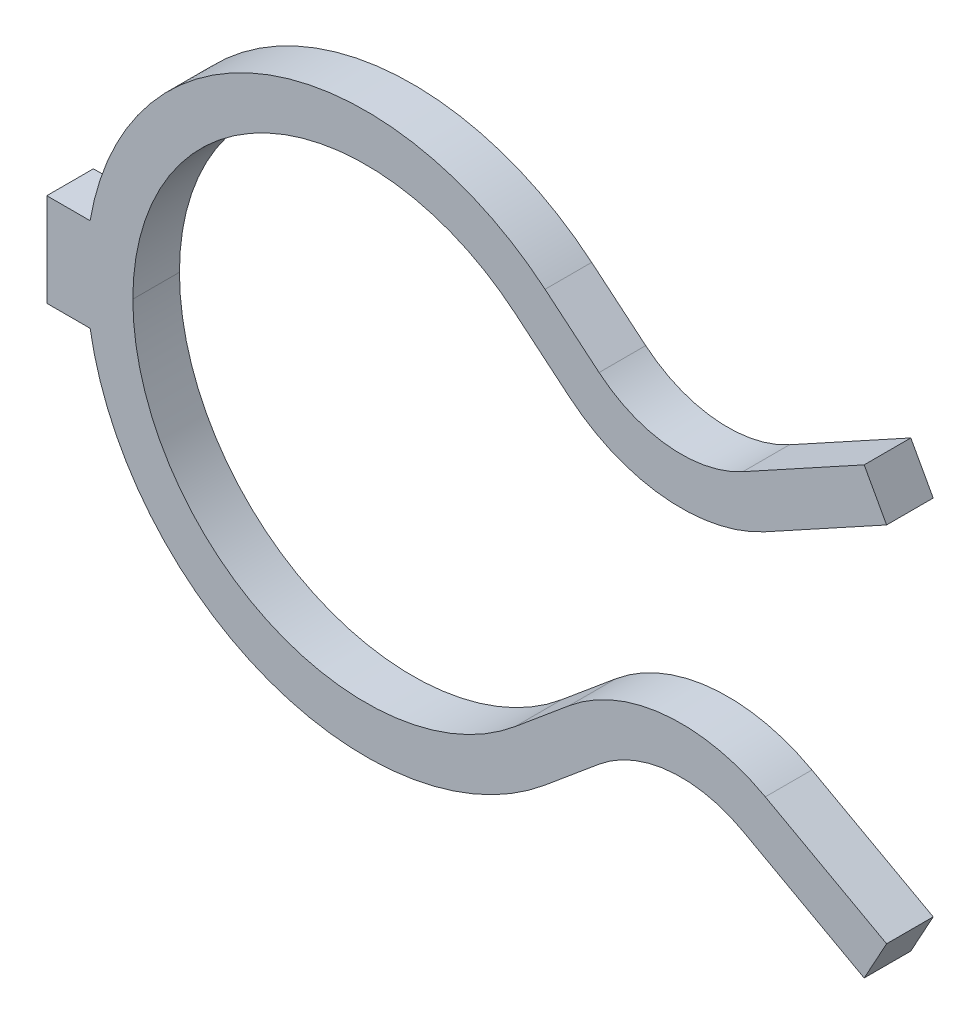
ISO-10303-21;
HEADER;
FILE_DESCRIPTION(('STEP AP214'),'2;1');
FILE_NAME('part.step','',(''),(''),'','','');
FILE_SCHEMA(('AUTOMOTIVE_DESIGN { 1 0 10303 214 1 1 1 1 }'));
ENDSEC;
DATA;
#1=APPLICATION_CONTEXT('core data for automotive mechanical design processes');
#2=APPLICATION_PROTOCOL_DEFINITION('international standard','automotive_design',2000,#1);
#3=PRODUCT_CONTEXT('',#1,'mechanical');
#4=PRODUCT('Part','Part','',(#3));
#5=PRODUCT_RELATED_PRODUCT_CATEGORY('part','',(#4));
#6=PRODUCT_DEFINITION_FORMATION('','',#4);
#7=PRODUCT_DEFINITION_CONTEXT('part definition',#1,'design');
#8=PRODUCT_DEFINITION('design','',#6,#7);
#9=PRODUCT_DEFINITION_SHAPE('','',#8);
#10=(LENGTH_UNIT() NAMED_UNIT(*) SI_UNIT(.MILLI.,.METRE.));
#11=(NAMED_UNIT(*) PLANE_ANGLE_UNIT() SI_UNIT($,.RADIAN.));
#12=(NAMED_UNIT(*) SI_UNIT($,.STERADIAN.) SOLID_ANGLE_UNIT());
#13=UNCERTAINTY_MEASURE_WITH_UNIT(LENGTH_MEASURE(1.E-05),#10,'distance_accuracy_value','');
#14=(GEOMETRIC_REPRESENTATION_CONTEXT(3) GLOBAL_UNCERTAINTY_ASSIGNED_CONTEXT((#13)) GLOBAL_UNIT_ASSIGNED_CONTEXT((#10,
#11,#12)) REPRESENTATION_CONTEXT('',''));
#15=CARTESIAN_POINT('',(0.,0.,0.));
#16=DIRECTION('',(0.,0.,1.));
#17=DIRECTION('',(1.,0.,0.));
#18=AXIS2_PLACEMENT_3D('',#15,#16,#17);
#19=CARTESIAN_POINT('',(0.,0.,5.08));
#20=DIRECTION('',(0.,0.,-1.));
#21=DIRECTION('',(-1.,0.,0.));
#22=AXIS2_PLACEMENT_3D('',#19,#20,#21);
#23=CYLINDRICAL_SURFACE('',#22,25.4);
#24=CARTESIAN_POINT('',(0.,0.,0.));
#25=DIRECTION('',(0.,0.,-1.));
#26=DIRECTION('',(1.,0.,0.));
#27=AXIS2_PLACEMENT_3D('',#24,#25,#26);
#28=CIRCLE('',#27,25.4);
#29=CARTESIAN_POINT('',(16.277171033262,-19.4990692894286,0.));
#30=VERTEX_POINT('',#29);
#31=CARTESIAN_POINT('',(-25.4,0.,0.));
#32=VERTEX_POINT('',#31);
#33=EDGE_CURVE('E296',#30,#32,#28,.T.);
#34=ORIENTED_EDGE('',*,*,#33,.T.);
#35=DIRECTION('',(0.,0.,1.));
#36=VECTOR('',#35,1.);
#37=CARTESIAN_POINT('',(-25.4,0.,5.08));
#38=LINE('',#37,#36);
#39=CARTESIAN_POINT('',(-25.4,0.,5.08));
#40=VERTEX_POINT('',#39);
#41=EDGE_CURVE('E11',#32,#40,#38,.T.);
#42=ORIENTED_EDGE('',*,*,#41,.T.);
#43=CARTESIAN_POINT('',(0.,0.,5.08));
#44=DIRECTION('',(0.,0.,-1.));
#45=DIRECTION('',(1.,0.,0.));
#46=AXIS2_PLACEMENT_3D('',#43,#44,#45);
#47=CIRCLE('',#46,25.4);
#48=CARTESIAN_POINT('',(16.277171033262,-19.4990692894286,5.08));
#49=VERTEX_POINT('',#48);
#50=EDGE_CURVE('E188',#49,#40,#47,.T.);
#51=ORIENTED_EDGE('',*,*,#50,.F.);
#52=DIRECTION('',(0.,0.,-1.));
#53=VECTOR('',#52,1.);
#54=CARTESIAN_POINT('',(16.277171033262,-19.4990692894286,5.08));
#55=LINE('',#54,#53);
#56=EDGE_CURVE('E255',#49,#30,#55,.T.);
#57=ORIENTED_EDGE('',*,*,#56,.T.);
#58=EDGE_LOOP('',(#34,#42,#51,#57));
#59=FACE_BOUND('',#58,.T.);
#60=ADVANCED_FACE('F43',(#59),#23,.F.);
#61=ORIENTED_EDGE('',*,*,#41,.F.);
#62=CARTESIAN_POINT('',(16.277171033262,19.4990692894286,0.));
#63=VERTEX_POINT('',#62);
#64=EDGE_CURVE('E200',#32,#63,#28,.T.);
#65=ORIENTED_EDGE('',*,*,#64,.T.);
#66=DIRECTION('',(0.,0.,-1.));
#67=VECTOR('',#66,1.);
#68=CARTESIAN_POINT('',(16.277171033262,19.4990692894286,5.08));
#69=LINE('',#68,#67);
#70=CARTESIAN_POINT('',(16.277171033262,19.4990692894286,5.08));
#71=VERTEX_POINT('',#70);
#72=EDGE_CURVE('E52',#71,#63,#69,.T.);
#73=ORIENTED_EDGE('',*,*,#72,.F.);
#74=EDGE_CURVE('E183',#40,#71,#47,.T.);
#75=ORIENTED_EDGE('',*,*,#74,.F.);
#76=EDGE_LOOP('',(#61,#65,#73,#75));
#77=FACE_BOUND('',#76,.T.);
#78=ADVANCED_FACE('F45',(#77),#23,.F.);
#79=CARTESIAN_POINT('',(16.277171033262,19.4990692894286,5.08));
#80=DIRECTION('',(0.640833505246534,0.767679893284591,0.));
#81=DIRECTION('',(-0.767679893284591,0.640833505246534,0.));
#82=AXIS2_PLACEMENT_3D('',#79,#80,#81);
#83=PLANE('',#82);
#84=DIRECTION('',(0.767679893284591,-0.640833505246534,0.));
#85=VECTOR('',#84,1.);
#86=CARTESIAN_POINT('',(16.277171033262,19.4990692894286,0.));
#87=LINE('',#86,#85);
#88=CARTESIAN_POINT('',(22.1629066010681,14.5858540445516,0.));
#89=VERTEX_POINT('',#88);
#90=EDGE_CURVE('E294',#63,#89,#87,.T.);
#91=ORIENTED_EDGE('',*,*,#90,.T.);
#92=DIRECTION('',(0.,0.,-1.));
#93=VECTOR('',#92,1.);
#94=CARTESIAN_POINT('',(22.1629066010681,14.5858540445516,5.08));
#95=LINE('',#94,#93);
#96=CARTESIAN_POINT('',(22.1629066010681,14.5858540445516,5.08));
#97=VERTEX_POINT('',#96);
#98=EDGE_CURVE('E196',#97,#89,#95,.T.);
#99=ORIENTED_EDGE('',*,*,#98,.F.);
#100=DIRECTION('',(0.767679893284591,-0.640833505246534,0.));
#101=VECTOR('',#100,1.);
#102=CARTESIAN_POINT('',(16.277171033262,19.4990692894286,5.08));
#103=LINE('',#102,#101);
#104=EDGE_CURVE('E186',#71,#97,#103,.T.);
#105=ORIENTED_EDGE('',*,*,#104,.F.);
#106=ORIENTED_EDGE('',*,*,#72,.T.);
#107=EDGE_LOOP('',(#91,#99,#105,#106));
#108=FACE_BOUND('',#107,.T.);
#109=ADVANCED_FACE('F194',(#108),#83,.F.);
#110=CARTESIAN_POINT('',(34.3707848760146,29.210156011623,5.08));
#111=DIRECTION('',(0.,0.,-1.));
#112=DIRECTION('',(-1.,0.,0.));
#113=AXIS2_PLACEMENT_3D('',#110,#111,#112);
#114=CYLINDRICAL_SURFACE('',#113,19.05);
#115=CARTESIAN_POINT('',(34.3707848760146,29.210156011623,0.));
#116=DIRECTION('',(0.,0.,1.));
#117=DIRECTION('',(1.,0.,0.));
#118=AXIS2_PLACEMENT_3D('',#115,#116,#117);
#119=CIRCLE('',#118,19.05);
#120=CARTESIAN_POINT('',(43.5359528241278,12.5097908514573,0.));
#121=VERTEX_POINT('',#120);
#122=EDGE_CURVE('E292',#89,#121,#119,.T.);
#123=ORIENTED_EDGE('',*,*,#122,.T.);
#124=DIRECTION('',(0.,0.,-1.));
#125=VECTOR('',#124,1.);
#126=CARTESIAN_POINT('',(43.5359528241278,12.5097908514573,5.08));
#127=LINE('',#126,#125);
#128=CARTESIAN_POINT('',(43.5359528241278,12.5097908514573,5.08));
#129=VERTEX_POINT('',#128);
#130=EDGE_CURVE('E202',#129,#121,#127,.T.);
#131=ORIENTED_EDGE('',*,*,#130,.F.);
#132=CARTESIAN_POINT('',(34.3707848760146,29.210156011623,5.08));
#133=DIRECTION('',(0.,0.,1.));
#134=DIRECTION('',(1.,0.,0.));
#135=AXIS2_PLACEMENT_3D('',#132,#133,#134);
#136=CIRCLE('',#135,19.05);
#137=EDGE_CURVE('E198',#97,#129,#136,.T.);
#138=ORIENTED_EDGE('',*,*,#137,.F.);
#139=ORIENTED_EDGE('',*,*,#98,.T.);
#140=EDGE_LOOP('',(#123,#131,#138,#139));
#141=FACE_BOUND('',#140,.T.);
#142=ADVANCED_FACE('F335',(#141),#114,.T.);
#143=CARTESIAN_POINT('',(43.5359528241278,12.5097908514573,5.08));
#144=DIRECTION('',(-0.481111178378644,0.876659588460146,0.));
#145=DIRECTION('',(-0.876659588460146,-0.481111178378644,0.));
#146=AXIS2_PLACEMENT_3D('',#143,#144,#145);
#147=PLANE('',#146);
#148=DIRECTION('',(0.876659588460146,0.481111178378644,0.));
#149=VECTOR('',#148,1.);
#150=CARTESIAN_POINT('',(43.5359528241278,12.5097908514573,0.));
#151=LINE('',#150,#149);
#152=CARTESIAN_POINT('',(56.757436861166,19.7657472668168,0.));
#153=VERTEX_POINT('',#152);
#154=EDGE_CURVE('E290',#121,#153,#151,.T.);
#155=ORIENTED_EDGE('',*,*,#154,.T.);
#156=DIRECTION('',(0.,0.,-1.));
#157=VECTOR('',#156,1.);
#158=CARTESIAN_POINT('',(56.757436861166,19.7657472668168,5.08));
#159=LINE('',#158,#157);
#160=CARTESIAN_POINT('',(56.757436861166,19.7657472668168,5.08));
#161=VERTEX_POINT('',#160);
#162=EDGE_CURVE('E207',#161,#153,#159,.T.);
#163=ORIENTED_EDGE('',*,*,#162,.F.);
#164=DIRECTION('',(0.876659588460146,0.481111178378644,0.));
#165=VECTOR('',#164,1.);
#166=CARTESIAN_POINT('',(43.5359528241278,12.5097908514573,5.08));
#167=LINE('',#166,#165);
#168=EDGE_CURVE('E329',#129,#161,#167,.T.);
#169=ORIENTED_EDGE('',*,*,#168,.F.);
#170=ORIENTED_EDGE('',*,*,#130,.T.);
#171=EDGE_LOOP('',(#155,#163,#169,#170));
#172=FACE_BOUND('',#171,.T.);
#173=ADVANCED_FACE('F339',(#172),#147,.F.);
#174=CARTESIAN_POINT('',(56.757436861166,19.7657472668168,5.08));
#175=DIRECTION('',(-0.876659588460146,-0.481111178378643,0.));
#176=DIRECTION('',(0.481111178378643,-0.876659588460146,0.));
#177=AXIS2_PLACEMENT_3D('',#174,#175,#176);
#178=PLANE('',#177);
#179=DIRECTION('',(-0.481111178378643,0.876659588460146,0.));
#180=VECTOR('',#179,1.);
#181=CARTESIAN_POINT('',(56.757436861166,19.7657472668168,0.));
#182=LINE('',#181,#180);
#183=CARTESIAN_POINT('',(54.3133920750025,24.2191779761944,0.));
#184=VERTEX_POINT('',#183);
#185=EDGE_CURVE('E288',#153,#184,#182,.T.);
#186=ORIENTED_EDGE('',*,*,#185,.T.);
#187=DIRECTION('',(0.,0.,-1.));
#188=VECTOR('',#187,1.);
#189=CARTESIAN_POINT('',(54.3133920750025,24.2191779761944,5.08));
#190=LINE('',#189,#188);
#191=CARTESIAN_POINT('',(54.3133920750025,24.2191779761944,5.08));
#192=VERTEX_POINT('',#191);
#193=EDGE_CURVE('E210',#192,#184,#190,.T.);
#194=ORIENTED_EDGE('',*,*,#193,.F.);
#195=DIRECTION('',(-0.481111178378643,0.876659588460146,0.));
#196=VECTOR('',#195,1.);
#197=CARTESIAN_POINT('',(56.757436861166,19.7657472668168,5.08));
#198=LINE('',#197,#196);
#199=EDGE_CURVE('E327',#161,#192,#198,.T.);
#200=ORIENTED_EDGE('',*,*,#199,.F.);
#201=ORIENTED_EDGE('',*,*,#162,.T.);
#202=EDGE_LOOP('',(#186,#194,#200,#201));
#203=FACE_BOUND('',#202,.T.);
#204=ADVANCED_FACE('F344',(#203),#178,.F.);
#205=CARTESIAN_POINT('',(41.0919080379643,16.9632215608348,5.08));
#206=DIRECTION('',(0.481111178378644,-0.876659588460146,0.));
#207=DIRECTION('',(0.876659588460146,0.481111178378644,0.));
#208=AXIS2_PLACEMENT_3D('',#205,#206,#207);
#209=PLANE('',#208);
#210=DIRECTION('',(-0.876659588460146,-0.481111178378644,0.));
#211=VECTOR('',#210,1.);
#212=CARTESIAN_POINT('',(41.0919080379643,16.9632215608348,0.));
#213=LINE('',#212,#211);
#214=CARTESIAN_POINT('',(41.0919080379643,16.9632215608348,0.));
#215=VERTEX_POINT('',#214);
#216=EDGE_CURVE('E286',#184,#215,#213,.T.);
#217=ORIENTED_EDGE('',*,*,#216,.T.);
#218=DIRECTION('',(0.,0.,-1.));
#219=VECTOR('',#218,1.);
#220=CARTESIAN_POINT('',(41.0919080379643,16.9632215608348,5.08));
#221=LINE('',#220,#219);
#222=CARTESIAN_POINT('',(41.0919080379643,16.9632215608348,5.08));
#223=VERTEX_POINT('',#222);
#224=EDGE_CURVE('E213',#223,#215,#221,.T.);
#225=ORIENTED_EDGE('',*,*,#224,.F.);
#226=DIRECTION('',(-0.876659588460146,-0.481111178378644,0.));
#227=VECTOR('',#226,1.);
#228=CARTESIAN_POINT('',(41.0919080379643,16.9632215608348,5.08));
#229=LINE('',#228,#227);
#230=EDGE_CURVE('E325',#192,#223,#229,.T.);
#231=ORIENTED_EDGE('',*,*,#230,.F.);
#232=ORIENTED_EDGE('',*,*,#193,.T.);
#233=EDGE_LOOP('',(#217,#225,#231,#232));
#234=FACE_BOUND('',#233,.T.);
#235=ADVANCED_FACE('F350',(#234),#209,.F.);
#236=CARTESIAN_POINT('',(34.3707848760146,29.210156011623,5.08));
#237=DIRECTION('',(0.,0.,-1.));
#238=DIRECTION('',(-1.,0.,0.));
#239=AXIS2_PLACEMENT_3D('',#236,#237,#238);
#240=CYLINDRICAL_SURFACE('',#239,13.97);
#241=CARTESIAN_POINT('',(34.3707848760146,29.210156011623,0.));
#242=DIRECTION('',(0.,0.,-1.));
#243=DIRECTION('',(1.,0.,0.));
#244=AXIS2_PLACEMENT_3D('',#241,#242,#243);
#245=CIRCLE('',#244,13.97);
#246=CARTESIAN_POINT('',(25.4183408077205,18.4856679024373,0.));
#247=VERTEX_POINT('',#246);
#248=EDGE_CURVE('E284',#215,#247,#245,.T.);
#249=ORIENTED_EDGE('',*,*,#248,.T.);
#250=DIRECTION('',(0.,0.,-1.));
#251=VECTOR('',#250,1.);
#252=CARTESIAN_POINT('',(25.4183408077205,18.4856679024373,5.08));
#253=LINE('',#252,#251);
#254=CARTESIAN_POINT('',(25.4183408077205,18.4856679024373,5.08));
#255=VERTEX_POINT('',#254);
#256=EDGE_CURVE('E216',#255,#247,#253,.T.);
#257=ORIENTED_EDGE('',*,*,#256,.F.);
#258=CARTESIAN_POINT('',(34.3707848760146,29.210156011623,5.08));
#259=DIRECTION('',(0.,0.,-1.));
#260=DIRECTION('',(1.,0.,0.));
#261=AXIS2_PLACEMENT_3D('',#258,#259,#260);
#262=CIRCLE('',#261,13.97);
#263=EDGE_CURVE('E323',#223,#255,#262,.T.);
#264=ORIENTED_EDGE('',*,*,#263,.F.);
#265=ORIENTED_EDGE('',*,*,#224,.T.);
#266=EDGE_LOOP('',(#249,#257,#264,#265));
#267=FACE_BOUND('',#266,.T.);
#268=ADVANCED_FACE('F354',(#267),#240,.F.);
#269=CARTESIAN_POINT('',(19.5326052399144,23.3988831473143,5.08));
#270=DIRECTION('',(-0.640833505246533,-0.767679893284591,0.));
#271=DIRECTION('',(0.767679893284591,-0.640833505246533,0.));
#272=AXIS2_PLACEMENT_3D('',#269,#270,#271);
#273=PLANE('',#272);
#274=DIRECTION('',(-0.767679893284591,0.640833505246533,0.));
#275=VECTOR('',#274,1.);
#276=CARTESIAN_POINT('',(19.5326052399144,23.3988831473143,0.));
#277=LINE('',#276,#275);
#278=CARTESIAN_POINT('',(19.5326052399144,23.3988831473143,0.));
#279=VERTEX_POINT('',#278);
#280=EDGE_CURVE('E282',#247,#279,#277,.T.);
#281=ORIENTED_EDGE('',*,*,#280,.T.);
#282=DIRECTION('',(0.,0.,-1.));
#283=VECTOR('',#282,1.);
#284=CARTESIAN_POINT('',(19.5326052399144,23.3988831473143,5.08));
#285=LINE('',#284,#283);
#286=CARTESIAN_POINT('',(19.5326052399144,23.3988831473143,5.08));
#287=VERTEX_POINT('',#286);
#288=EDGE_CURVE('E219',#287,#279,#285,.T.);
#289=ORIENTED_EDGE('',*,*,#288,.F.);
#290=DIRECTION('',(-0.767679893284591,0.640833505246533,0.));
#291=VECTOR('',#290,1.);
#292=CARTESIAN_POINT('',(19.5326052399144,23.3988831473143,5.08));
#293=LINE('',#292,#291);
#294=EDGE_CURVE('E321',#255,#287,#293,.T.);
#295=ORIENTED_EDGE('',*,*,#294,.F.);
#296=ORIENTED_EDGE('',*,*,#256,.T.);
#297=EDGE_LOOP('',(#281,#289,#295,#296));
#298=FACE_BOUND('',#297,.T.);
#299=ADVANCED_FACE('F359',(#298),#273,.F.);
#300=CARTESIAN_POINT('',(0.,0.,5.08));
#301=DIRECTION('',(0.,0.,-1.));
#302=DIRECTION('',(-1.,0.,0.));
#303=AXIS2_PLACEMENT_3D('',#300,#301,#302);
#304=CYLINDRICAL_SURFACE('',#303,30.48);
#305=CARTESIAN_POINT('',(0.,0.,0.));
#306=DIRECTION('',(0.,0.,1.));
#307=DIRECTION('',(1.,0.,0.));
#308=AXIS2_PLACEMENT_3D('',#305,#306,#307);
#309=CIRCLE('',#308,30.48);
#310=CARTESIAN_POINT('',(-30.053685298146,5.08,0.));
#311=VERTEX_POINT('',#310);
#312=EDGE_CURVE('E280',#279,#311,#309,.T.);
#313=ORIENTED_EDGE('',*,*,#312,.T.);
#314=DIRECTION('',(0.,0.,-1.));
#315=VECTOR('',#314,1.);
#316=CARTESIAN_POINT('',(-30.053685298146,5.08,5.08));
#317=LINE('',#316,#315);
#318=CARTESIAN_POINT('',(-30.053685298146,5.08,5.08));
#319=VERTEX_POINT('',#318);
#320=EDGE_CURVE('E222',#319,#311,#317,.T.);
#321=ORIENTED_EDGE('',*,*,#320,.F.);
#322=CARTESIAN_POINT('',(0.,0.,5.08));
#323=DIRECTION('',(0.,0.,1.));
#324=DIRECTION('',(1.,0.,0.));
#325=AXIS2_PLACEMENT_3D('',#322,#323,#324);
#326=CIRCLE('',#325,30.48);
#327=EDGE_CURVE('E319',#287,#319,#326,.T.);
#328=ORIENTED_EDGE('',*,*,#327,.F.);
#329=ORIENTED_EDGE('',*,*,#288,.T.);
#330=EDGE_LOOP('',(#313,#321,#328,#329));
#331=FACE_BOUND('',#330,.T.);
#332=ADVANCED_FACE('F365',(#331),#304,.T.);
#333=CARTESIAN_POINT('',(-30.053685298146,5.08,5.08));
#334=DIRECTION('',(0.,-1.,0.));
#335=DIRECTION('',(1.,0.,0.));
#336=AXIS2_PLACEMENT_3D('',#333,#334,#335);
#337=PLANE('',#336);
#338=DIRECTION('',(-1.,0.,0.));
#339=VECTOR('',#338,1.);
#340=CARTESIAN_POINT('',(-30.053685298146,5.08,0.));
#341=LINE('',#340,#339);
#342=CARTESIAN_POINT('',(-34.776815298146,5.08,0.));
#343=VERTEX_POINT('',#342);
#344=EDGE_CURVE('E278',#311,#343,#341,.T.);
#345=ORIENTED_EDGE('',*,*,#344,.T.);
#346=DIRECTION('',(0.,0.,-1.));
#347=VECTOR('',#346,1.);
#348=CARTESIAN_POINT('',(-34.776815298146,5.08,5.08));
#349=LINE('',#348,#347);
#350=CARTESIAN_POINT('',(-34.776815298146,5.08,5.08));
#351=VERTEX_POINT('',#350);
#352=EDGE_CURVE('E225',#351,#343,#349,.T.);
#353=ORIENTED_EDGE('',*,*,#352,.F.);
#354=DIRECTION('',(-1.,0.,0.));
#355=VECTOR('',#354,1.);
#356=CARTESIAN_POINT('',(-30.053685298146,5.08,5.08));
#357=LINE('',#356,#355);
#358=EDGE_CURVE('E317',#319,#351,#357,.T.);
#359=ORIENTED_EDGE('',*,*,#358,.F.);
#360=ORIENTED_EDGE('',*,*,#320,.T.);
#361=EDGE_LOOP('',(#345,#353,#359,#360));
#362=FACE_BOUND('',#361,.T.);
#363=ADVANCED_FACE('F369',(#362),#337,.F.);
#364=CARTESIAN_POINT('',(-34.776815298146,5.08,5.08));
#365=DIRECTION('',(1.,0.,0.));
#366=DIRECTION('',(0.,0.,-1.));
#367=AXIS2_PLACEMENT_3D('',#364,#365,#366);
#368=PLANE('',#367);
#369=DIRECTION('',(0.,-1.,0.));
#370=VECTOR('',#369,1.);
#371=CARTESIAN_POINT('',(-34.776815298146,5.08,0.));
#372=LINE('',#371,#370);
#373=CARTESIAN_POINT('',(-34.776815298146,-5.08,0.));
#374=VERTEX_POINT('',#373);
#375=EDGE_CURVE('E276',#343,#374,#372,.T.);
#376=ORIENTED_EDGE('',*,*,#375,.T.);
#377=DIRECTION('',(0.,0.,-1.));
#378=VECTOR('',#377,1.);
#379=CARTESIAN_POINT('',(-34.776815298146,-5.08,5.08));
#380=LINE('',#379,#378);
#381=CARTESIAN_POINT('',(-34.776815298146,-5.08,5.08));
#382=VERTEX_POINT('',#381);
#383=EDGE_CURVE('E228',#382,#374,#380,.T.);
#384=ORIENTED_EDGE('',*,*,#383,.F.);
#385=DIRECTION('',(0.,-1.,0.));
#386=VECTOR('',#385,1.);
#387=CARTESIAN_POINT('',(-34.776815298146,5.08,5.08));
#388=LINE('',#387,#386);
#389=EDGE_CURVE('E315',#351,#382,#388,.T.);
#390=ORIENTED_EDGE('',*,*,#389,.F.);
#391=ORIENTED_EDGE('',*,*,#352,.T.);
#392=EDGE_LOOP('',(#376,#384,#390,#391));
#393=FACE_BOUND('',#392,.T.);
#394=ADVANCED_FACE('F374',(#393),#368,.F.);
#395=CARTESIAN_POINT('',(-30.053685298146,-5.08,5.08));
#396=DIRECTION('',(0.,1.,0.));
#397=DIRECTION('',(-1.,0.,0.));
#398=AXIS2_PLACEMENT_3D('',#395,#396,#397);
#399=PLANE('',#398);
#400=DIRECTION('',(1.,0.,0.));
#401=VECTOR('',#400,1.);
#402=CARTESIAN_POINT('',(-30.053685298146,-5.08,0.));
#403=LINE('',#402,#401);
#404=CARTESIAN_POINT('',(-30.053685298146,-5.08,0.));
#405=VERTEX_POINT('',#404);
#406=EDGE_CURVE('E274',#374,#405,#403,.T.);
#407=ORIENTED_EDGE('',*,*,#406,.T.);
#408=DIRECTION('',(0.,0.,-1.));
#409=VECTOR('',#408,1.);
#410=CARTESIAN_POINT('',(-30.053685298146,-5.08,5.08));
#411=LINE('',#410,#409);
#412=CARTESIAN_POINT('',(-30.053685298146,-5.08,5.08));
#413=VERTEX_POINT('',#412);
#414=EDGE_CURVE('E231',#413,#405,#411,.T.);
#415=ORIENTED_EDGE('',*,*,#414,.F.);
#416=DIRECTION('',(1.,0.,0.));
#417=VECTOR('',#416,1.);
#418=CARTESIAN_POINT('',(-30.053685298146,-5.08,5.08));
#419=LINE('',#418,#417);
#420=EDGE_CURVE('E313',#382,#413,#419,.T.);
#421=ORIENTED_EDGE('',*,*,#420,.F.);
#422=ORIENTED_EDGE('',*,*,#383,.T.);
#423=EDGE_LOOP('',(#407,#415,#421,#422));
#424=FACE_BOUND('',#423,.T.);
#425=ADVANCED_FACE('F380',(#424),#399,.F.);
#426=CARTESIAN_POINT('',(0.,0.,5.08));
#427=DIRECTION('',(0.,0.,-1.));
#428=DIRECTION('',(-1.,0.,0.));
#429=AXIS2_PLACEMENT_3D('',#426,#427,#428);
#430=CYLINDRICAL_SURFACE('',#429,30.48);
#431=CARTESIAN_POINT('',(0.,0.,0.));
#432=DIRECTION('',(0.,0.,1.));
#433=DIRECTION('',(1.,0.,0.));
#434=AXIS2_PLACEMENT_3D('',#431,#432,#433);
#435=CIRCLE('',#434,30.48);
#436=CARTESIAN_POINT('',(19.5326052399144,-23.3988831473143,0.));
#437=VERTEX_POINT('',#436);
#438=EDGE_CURVE('E272',#405,#437,#435,.T.);
#439=ORIENTED_EDGE('',*,*,#438,.T.);
#440=DIRECTION('',(0.,0.,-1.));
#441=VECTOR('',#440,1.);
#442=CARTESIAN_POINT('',(19.5326052399144,-23.3988831473143,5.08));
#443=LINE('',#442,#441);
#444=CARTESIAN_POINT('',(19.5326052399144,-23.3988831473143,5.08));
#445=VERTEX_POINT('',#444);
#446=EDGE_CURVE('E234',#445,#437,#443,.T.);
#447=ORIENTED_EDGE('',*,*,#446,.F.);
#448=CARTESIAN_POINT('',(0.,0.,5.08));
#449=DIRECTION('',(0.,0.,1.));
#450=DIRECTION('',(1.,0.,0.));
#451=AXIS2_PLACEMENT_3D('',#448,#449,#450);
#452=CIRCLE('',#451,30.48);
#453=EDGE_CURVE('E311',#413,#445,#452,.T.);
#454=ORIENTED_EDGE('',*,*,#453,.F.);
#455=ORIENTED_EDGE('',*,*,#414,.T.);
#456=EDGE_LOOP('',(#439,#447,#454,#455));
#457=FACE_BOUND('',#456,.T.);
#458=ADVANCED_FACE('F384',(#457),#430,.T.);
#459=CARTESIAN_POINT('',(19.5326052399144,-23.3988831473143,5.08));
#460=DIRECTION('',(-0.640833505246533,0.767679893284591,0.));
#461=DIRECTION('',(-0.767679893284591,-0.640833505246533,0.));
#462=AXIS2_PLACEMENT_3D('',#459,#460,#461);
#463=PLANE('',#462);
#464=DIRECTION('',(0.767679893284591,0.640833505246533,0.));
#465=VECTOR('',#464,1.);
#466=CARTESIAN_POINT('',(19.5326052399144,-23.3988831473143,0.));
#467=LINE('',#466,#465);
#468=CARTESIAN_POINT('',(25.4183408077205,-18.4856679024373,0.));
#469=VERTEX_POINT('',#468);
#470=EDGE_CURVE('E270',#437,#469,#467,.T.);
#471=ORIENTED_EDGE('',*,*,#470,.T.);
#472=DIRECTION('',(0.,0.,-1.));
#473=VECTOR('',#472,1.);
#474=CARTESIAN_POINT('',(25.4183408077205,-18.4856679024373,5.08));
#475=LINE('',#474,#473);
#476=CARTESIAN_POINT('',(25.4183408077205,-18.4856679024373,5.08));
#477=VERTEX_POINT('',#476);
#478=EDGE_CURVE('E237',#477,#469,#475,.T.);
#479=ORIENTED_EDGE('',*,*,#478,.F.);
#480=DIRECTION('',(0.767679893284591,0.640833505246533,0.));
#481=VECTOR('',#480,1.);
#482=CARTESIAN_POINT('',(19.5326052399144,-23.3988831473143,5.08));
#483=LINE('',#482,#481);
#484=EDGE_CURVE('E309',#445,#477,#483,.T.);
#485=ORIENTED_EDGE('',*,*,#484,.F.);
#486=ORIENTED_EDGE('',*,*,#446,.T.);
#487=EDGE_LOOP('',(#471,#479,#485,#486));
#488=FACE_BOUND('',#487,.T.);
#489=ADVANCED_FACE('F389',(#488),#463,.F.);
#490=CARTESIAN_POINT('',(34.3707848760146,-29.210156011623,5.08));
#491=DIRECTION('',(0.,0.,-1.));
#492=DIRECTION('',(-1.,0.,0.));
#493=AXIS2_PLACEMENT_3D('',#490,#491,#492);
#494=CYLINDRICAL_SURFACE('',#493,13.97);
#495=CARTESIAN_POINT('',(34.3707848760146,-29.210156011623,0.));
#496=DIRECTION('',(0.,0.,-1.));
#497=DIRECTION('',(-1.,0.,0.));
#498=AXIS2_PLACEMENT_3D('',#495,#496,#497);
#499=CIRCLE('',#498,13.97);
#500=CARTESIAN_POINT('',(41.0919080379643,-16.9632215608348,0.));
#501=VERTEX_POINT('',#500);
#502=EDGE_CURVE('E268',#469,#501,#499,.T.);
#503=ORIENTED_EDGE('',*,*,#502,.T.);
#504=DIRECTION('',(0.,0.,-1.));
#505=VECTOR('',#504,1.);
#506=CARTESIAN_POINT('',(41.0919080379643,-16.9632215608348,5.08));
#507=LINE('',#506,#505);
#508=CARTESIAN_POINT('',(41.0919080379643,-16.9632215608348,5.08));
#509=VERTEX_POINT('',#508);
#510=EDGE_CURVE('E240',#509,#501,#507,.T.);
#511=ORIENTED_EDGE('',*,*,#510,.F.);
#512=CARTESIAN_POINT('',(34.3707848760146,-29.210156011623,5.08));
#513=DIRECTION('',(0.,0.,-1.));
#514=DIRECTION('',(-1.,0.,0.));
#515=AXIS2_PLACEMENT_3D('',#512,#513,#514);
#516=CIRCLE('',#515,13.97);
#517=EDGE_CURVE('E307',#477,#509,#516,.T.);
#518=ORIENTED_EDGE('',*,*,#517,.F.);
#519=ORIENTED_EDGE('',*,*,#478,.T.);
#520=EDGE_LOOP('',(#503,#511,#518,#519));
#521=FACE_BOUND('',#520,.T.);
#522=ADVANCED_FACE('F395',(#521),#494,.F.);
#523=CARTESIAN_POINT('',(41.0919080379643,-16.9632215608348,5.08));
#524=DIRECTION('',(0.481111178378644,0.876659588460146,0.));
#525=DIRECTION('',(-0.876659588460146,0.481111178378644,0.));
#526=AXIS2_PLACEMENT_3D('',#523,#524,#525);
#527=PLANE('',#526);
#528=DIRECTION('',(0.876659588460146,-0.481111178378644,0.));
#529=VECTOR('',#528,1.);
#530=CARTESIAN_POINT('',(41.0919080379643,-16.9632215608348,0.));
#531=LINE('',#530,#529);
#532=CARTESIAN_POINT('',(54.3133920750025,-24.2191779761944,0.));
#533=VERTEX_POINT('',#532);
#534=EDGE_CURVE('E266',#501,#533,#531,.T.);
#535=ORIENTED_EDGE('',*,*,#534,.T.);
#536=DIRECTION('',(0.,0.,-1.));
#537=VECTOR('',#536,1.);
#538=CARTESIAN_POINT('',(54.3133920750025,-24.2191779761944,5.08));
#539=LINE('',#538,#537);
#540=CARTESIAN_POINT('',(54.3133920750025,-24.2191779761944,5.08));
#541=VERTEX_POINT('',#540);
#542=EDGE_CURVE('E243',#541,#533,#539,.T.);
#543=ORIENTED_EDGE('',*,*,#542,.F.);
#544=DIRECTION('',(0.876659588460146,-0.481111178378644,0.));
#545=VECTOR('',#544,1.);
#546=CARTESIAN_POINT('',(41.0919080379643,-16.9632215608348,5.08));
#547=LINE('',#546,#545);
#548=EDGE_CURVE('E305',#509,#541,#547,.T.);
#549=ORIENTED_EDGE('',*,*,#548,.F.);
#550=ORIENTED_EDGE('',*,*,#510,.T.);
#551=EDGE_LOOP('',(#535,#543,#549,#550));
#552=FACE_BOUND('',#551,.T.);
#553=ADVANCED_FACE('F399',(#552),#527,.F.);
#554=CARTESIAN_POINT('',(56.757436861166,-19.7657472668168,5.08));
#555=DIRECTION('',(-0.876659588460146,0.481111178378643,0.));
#556=DIRECTION('',(-0.481111178378643,-0.876659588460146,0.));
#557=AXIS2_PLACEMENT_3D('',#554,#555,#556);
#558=PLANE('',#557);
#559=DIRECTION('',(0.481111178378643,0.876659588460146,0.));
#560=VECTOR('',#559,1.);
#561=CARTESIAN_POINT('',(56.757436861166,-19.7657472668168,0.));
#562=LINE('',#561,#560);
#563=CARTESIAN_POINT('',(56.757436861166,-19.7657472668168,0.));
#564=VERTEX_POINT('',#563);
#565=EDGE_CURVE('E264',#533,#564,#562,.T.);
#566=ORIENTED_EDGE('',*,*,#565,.T.);
#567=DIRECTION('',(0.,0.,-1.));
#568=VECTOR('',#567,1.);
#569=CARTESIAN_POINT('',(56.757436861166,-19.7657472668168,5.08));
#570=LINE('',#569,#568);
#571=CARTESIAN_POINT('',(56.757436861166,-19.7657472668168,5.08));
#572=VERTEX_POINT('',#571);
#573=EDGE_CURVE('E246',#572,#564,#570,.T.);
#574=ORIENTED_EDGE('',*,*,#573,.F.);
#575=DIRECTION('',(0.481111178378643,0.876659588460146,0.));
#576=VECTOR('',#575,1.);
#577=CARTESIAN_POINT('',(56.757436861166,-19.7657472668168,5.08));
#578=LINE('',#577,#576);
#579=EDGE_CURVE('E303',#541,#572,#578,.T.);
#580=ORIENTED_EDGE('',*,*,#579,.F.);
#581=ORIENTED_EDGE('',*,*,#542,.T.);
#582=EDGE_LOOP('',(#566,#574,#580,#581));
#583=FACE_BOUND('',#582,.T.);
#584=ADVANCED_FACE('F404',(#583),#558,.F.);
#585=CARTESIAN_POINT('',(43.5359528241278,-12.5097908514573,5.08));
#586=DIRECTION('',(-0.481111178378644,-0.876659588460146,0.));
#587=DIRECTION('',(0.876659588460146,-0.481111178378644,0.));
#588=AXIS2_PLACEMENT_3D('',#585,#586,#587);
#589=PLANE('',#588);
#590=DIRECTION('',(-0.876659588460146,0.481111178378644,0.));
#591=VECTOR('',#590,1.);
#592=CARTESIAN_POINT('',(43.5359528241278,-12.5097908514573,0.));
#593=LINE('',#592,#591);
#594=CARTESIAN_POINT('',(43.5359528241278,-12.5097908514573,0.));
#595=VERTEX_POINT('',#594);
#596=EDGE_CURVE('E262',#564,#595,#593,.T.);
#597=ORIENTED_EDGE('',*,*,#596,.T.);
#598=DIRECTION('',(0.,0.,-1.));
#599=VECTOR('',#598,1.);
#600=CARTESIAN_POINT('',(43.5359528241278,-12.5097908514573,5.08));
#601=LINE('',#600,#599);
#602=CARTESIAN_POINT('',(43.5359528241278,-12.5097908514573,5.08));
#603=VERTEX_POINT('',#602);
#604=EDGE_CURVE('E249',#603,#595,#601,.T.);
#605=ORIENTED_EDGE('',*,*,#604,.F.);
#606=DIRECTION('',(-0.876659588460146,0.481111178378644,0.));
#607=VECTOR('',#606,1.);
#608=CARTESIAN_POINT('',(43.5359528241278,-12.5097908514573,5.08));
#609=LINE('',#608,#607);
#610=EDGE_CURVE('E301',#572,#603,#609,.T.);
#611=ORIENTED_EDGE('',*,*,#610,.F.);
#612=ORIENTED_EDGE('',*,*,#573,.T.);
#613=EDGE_LOOP('',(#597,#605,#611,#612));
#614=FACE_BOUND('',#613,.T.);
#615=ADVANCED_FACE('F410',(#614),#589,.F.);
#616=CARTESIAN_POINT('',(34.3707848760146,-29.210156011623,5.08));
#617=DIRECTION('',(0.,0.,-1.));
#618=DIRECTION('',(-1.,0.,0.));
#619=AXIS2_PLACEMENT_3D('',#616,#617,#618);
#620=CYLINDRICAL_SURFACE('',#619,19.05);
#621=CARTESIAN_POINT('',(34.3707848760146,-29.210156011623,0.));
#622=DIRECTION('',(0.,0.,1.));
#623=DIRECTION('',(-1.,0.,0.));
#624=AXIS2_PLACEMENT_3D('',#621,#622,#623);
#625=CIRCLE('',#624,19.05);
#626=CARTESIAN_POINT('',(22.1629066010681,-14.5858540445516,0.));
#627=VERTEX_POINT('',#626);
#628=EDGE_CURVE('E260',#595,#627,#625,.T.);
#629=ORIENTED_EDGE('',*,*,#628,.T.);
#630=DIRECTION('',(0.,0.,-1.));
#631=VECTOR('',#630,1.);
#632=CARTESIAN_POINT('',(22.1629066010681,-14.5858540445516,5.08));
#633=LINE('',#632,#631);
#634=CARTESIAN_POINT('',(22.1629066010681,-14.5858540445516,5.08));
#635=VERTEX_POINT('',#634);
#636=EDGE_CURVE('E252',#635,#627,#633,.T.);
#637=ORIENTED_EDGE('',*,*,#636,.F.);
#638=CARTESIAN_POINT('',(34.3707848760146,-29.210156011623,5.08));
#639=DIRECTION('',(0.,0.,1.));
#640=DIRECTION('',(-1.,0.,0.));
#641=AXIS2_PLACEMENT_3D('',#638,#639,#640);
#642=CIRCLE('',#641,19.05);
#643=EDGE_CURVE('E299',#603,#635,#642,.T.);
#644=ORIENTED_EDGE('',*,*,#643,.F.);
#645=ORIENTED_EDGE('',*,*,#604,.T.);
#646=EDGE_LOOP('',(#629,#637,#644,#645));
#647=FACE_BOUND('',#646,.T.);
#648=ADVANCED_FACE('F414',(#647),#620,.T.);
#649=CARTESIAN_POINT('',(16.277171033262,-19.4990692894286,5.08));
#650=DIRECTION('',(0.640833505246534,-0.767679893284591,0.));
#651=DIRECTION('',(0.767679893284591,0.640833505246534,0.));
#652=AXIS2_PLACEMENT_3D('',#649,#650,#651);
#653=PLANE('',#652);
#654=DIRECTION('',(-0.767679893284591,-0.640833505246534,0.));
#655=VECTOR('',#654,1.);
#656=CARTESIAN_POINT('',(16.277171033262,-19.4990692894286,0.));
#657=LINE('',#656,#655);
#658=EDGE_CURVE('E190',#627,#30,#657,.T.);
#659=ORIENTED_EDGE('',*,*,#658,.T.);
#660=ORIENTED_EDGE('',*,*,#56,.F.);
#661=DIRECTION('',(-0.767679893284591,-0.640833505246534,0.));
#662=VECTOR('',#661,1.);
#663=CARTESIAN_POINT('',(16.277171033262,-19.4990692894286,5.08));
#664=LINE('',#663,#662);
#665=EDGE_CURVE('E258',#635,#49,#664,.T.);
#666=ORIENTED_EDGE('',*,*,#665,.F.);
#667=ORIENTED_EDGE('',*,*,#636,.T.);
#668=EDGE_LOOP('',(#659,#660,#666,#667));
#669=FACE_BOUND('',#668,.T.);
#670=ADVANCED_FACE('F419',(#669),#653,.F.);
#671=CARTESIAN_POINT('',(0.,0.,5.08));
#672=DIRECTION('',(0.,0.,1.));
#673=DIRECTION('',(1.,0.,0.));
#674=AXIS2_PLACEMENT_3D('',#671,#672,#673);
#675=PLANE('',#674);
#676=ORIENTED_EDGE('',*,*,#50,.T.);
#677=ORIENTED_EDGE('',*,*,#74,.T.);
#678=ORIENTED_EDGE('',*,*,#104,.T.);
#679=ORIENTED_EDGE('',*,*,#137,.T.);
#680=ORIENTED_EDGE('',*,*,#168,.T.);
#681=ORIENTED_EDGE('',*,*,#199,.T.);
#682=ORIENTED_EDGE('',*,*,#230,.T.);
#683=ORIENTED_EDGE('',*,*,#263,.T.);
#684=ORIENTED_EDGE('',*,*,#294,.T.);
#685=ORIENTED_EDGE('',*,*,#327,.T.);
#686=ORIENTED_EDGE('',*,*,#358,.T.);
#687=ORIENTED_EDGE('',*,*,#389,.T.);
#688=ORIENTED_EDGE('',*,*,#420,.T.);
#689=ORIENTED_EDGE('',*,*,#453,.T.);
#690=ORIENTED_EDGE('',*,*,#484,.T.);
#691=ORIENTED_EDGE('',*,*,#517,.T.);
#692=ORIENTED_EDGE('',*,*,#548,.T.);
#693=ORIENTED_EDGE('',*,*,#579,.T.);
#694=ORIENTED_EDGE('',*,*,#610,.T.);
#695=ORIENTED_EDGE('',*,*,#643,.T.);
#696=ORIENTED_EDGE('',*,*,#665,.T.);
#697=EDGE_LOOP('',(#676,#677,#678,#679,#680,#681,#682,#683,#684,#685,#686,#687,#688,#689,#690,
#691,#692,#693,#694,#695,#696));
#698=FACE_BOUND('',#697,.T.);
#699=ADVANCED_FACE('F185',(#698),#675,.T.);
#700=CARTESIAN_POINT('',(0.,0.,0.));
#701=DIRECTION('',(0.,0.,1.));
#702=DIRECTION('',(1.,0.,0.));
#703=AXIS2_PLACEMENT_3D('',#700,#701,#702);
#704=PLANE('',#703);
#705=ORIENTED_EDGE('',*,*,#33,.F.);
#706=ORIENTED_EDGE('',*,*,#658,.F.);
#707=ORIENTED_EDGE('',*,*,#628,.F.);
#708=ORIENTED_EDGE('',*,*,#596,.F.);
#709=ORIENTED_EDGE('',*,*,#565,.F.);
#710=ORIENTED_EDGE('',*,*,#534,.F.);
#711=ORIENTED_EDGE('',*,*,#502,.F.);
#712=ORIENTED_EDGE('',*,*,#470,.F.);
#713=ORIENTED_EDGE('',*,*,#438,.F.);
#714=ORIENTED_EDGE('',*,*,#406,.F.);
#715=ORIENTED_EDGE('',*,*,#375,.F.);
#716=ORIENTED_EDGE('',*,*,#344,.F.);
#717=ORIENTED_EDGE('',*,*,#312,.F.);
#718=ORIENTED_EDGE('',*,*,#280,.F.);
#719=ORIENTED_EDGE('',*,*,#248,.F.);
#720=ORIENTED_EDGE('',*,*,#216,.F.);
#721=ORIENTED_EDGE('',*,*,#185,.F.);
#722=ORIENTED_EDGE('',*,*,#154,.F.);
#723=ORIENTED_EDGE('',*,*,#122,.F.);
#724=ORIENTED_EDGE('',*,*,#90,.F.);
#725=ORIENTED_EDGE('',*,*,#64,.F.);
#726=EDGE_LOOP('',(#705,#706,#707,#708,#709,#710,#711,#712,#713,#714,#715,#716,#717,#718,#719,
#720,#721,#722,#723,#724,#725));
#727=FACE_BOUND('',#726,.T.);
#728=ADVANCED_FACE('F467',(#727),#704,.F.);
#729=CLOSED_SHELL('',(#60,#78,#109,#142,#173,#204,#235,#268,#299,#332,#363,#394,#425,#458,#489,
#522,#553,#584,#615,#648,#670,#699,#728));
#730=MANIFOLD_SOLID_BREP('B2',#729);
#731=ADVANCED_BREP_SHAPE_REPRESENTATION('',(#18,#730),#14);
#732=SHAPE_DEFINITION_REPRESENTATION(#9,#731);
ENDSEC;
END-ISO-10303-21;
